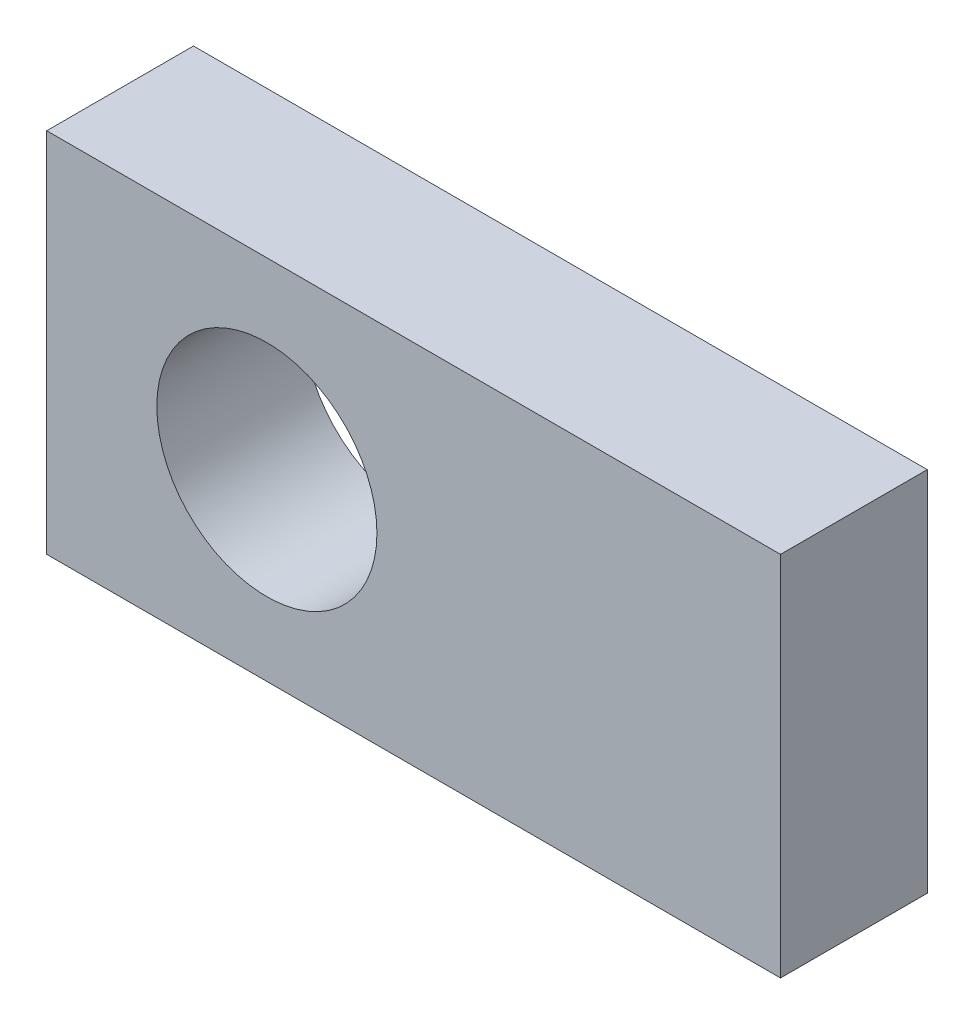
ISO-10303-21;
HEADER;
FILE_DESCRIPTION(('STEP AP214'),'2;1');
FILE_NAME('part.step','',(''),(''),'','','');
FILE_SCHEMA(('AUTOMOTIVE_DESIGN { 1 0 10303 214 1 1 1 1 }'));
ENDSEC;
DATA;
#1=APPLICATION_CONTEXT('core data for automotive mechanical design processes');
#2=APPLICATION_PROTOCOL_DEFINITION('international standard','automotive_design',2000,#1);
#3=PRODUCT_CONTEXT('',#1,'mechanical');
#4=PRODUCT('Part','Part','',(#3));
#5=PRODUCT_RELATED_PRODUCT_CATEGORY('part','',(#4));
#6=PRODUCT_DEFINITION_FORMATION('','',#4);
#7=PRODUCT_DEFINITION_CONTEXT('part definition',#1,'design');
#8=PRODUCT_DEFINITION('design','',#6,#7);
#9=PRODUCT_DEFINITION_SHAPE('','',#8);
#10=(LENGTH_UNIT() NAMED_UNIT(*) SI_UNIT(.MILLI.,.METRE.));
#11=(NAMED_UNIT(*) PLANE_ANGLE_UNIT() SI_UNIT($,.RADIAN.));
#12=(NAMED_UNIT(*) SI_UNIT($,.STERADIAN.) SOLID_ANGLE_UNIT());
#13=UNCERTAINTY_MEASURE_WITH_UNIT(LENGTH_MEASURE(1.E-05),#10,'distance_accuracy_value','');
#14=(GEOMETRIC_REPRESENTATION_CONTEXT(3) GLOBAL_UNCERTAINTY_ASSIGNED_CONTEXT((#13)) GLOBAL_UNIT_ASSIGNED_CONTEXT((#10,
#11,#12)) REPRESENTATION_CONTEXT('',''));
#15=CARTESIAN_POINT('',(0.,0.,0.));
#16=DIRECTION('',(0.,0.,1.));
#17=DIRECTION('',(1.,0.,0.));
#18=AXIS2_PLACEMENT_3D('',#15,#16,#17);
#19=CARTESIAN_POINT('',(0.,0.,4.));
#20=DIRECTION('',(0.,0.,-1.));
#21=DIRECTION('',(-1.,0.,0.));
#22=AXIS2_PLACEMENT_3D('',#19,#20,#21);
#23=PLANE('',#22);
#24=DIRECTION('',(0.,-1.,0.));
#25=VECTOR('',#24,1.);
#26=CARTESIAN_POINT('',(0.,0.,4.));
#27=LINE('',#26,#25);
#28=CARTESIAN_POINT('',(0.,10.,4.));
#29=VERTEX_POINT('',#28);
#30=CARTESIAN_POINT('',(0.,0.,4.));
#31=VERTEX_POINT('',#30);
#32=EDGE_CURVE('E84',#29,#31,#27,.T.);
#33=ORIENTED_EDGE('',*,*,#32,.T.);
#34=DIRECTION('',(1.,0.,0.));
#35=VECTOR('',#34,1.);
#36=CARTESIAN_POINT('',(0.,0.,4.));
#37=LINE('',#36,#35);
#38=CARTESIAN_POINT('',(20.,0.,4.));
#39=VERTEX_POINT('',#38);
#40=EDGE_CURVE('E79',#31,#39,#37,.T.);
#41=ORIENTED_EDGE('',*,*,#40,.T.);
#42=DIRECTION('',(0.,1.,0.));
#43=VECTOR('',#42,1.);
#44=CARTESIAN_POINT('',(20.,0.,4.));
#45=LINE('',#44,#43);
#46=CARTESIAN_POINT('',(20.,10.,4.));
#47=VERTEX_POINT('',#46);
#48=EDGE_CURVE('E82',#39,#47,#45,.T.);
#49=ORIENTED_EDGE('',*,*,#48,.T.);
#50=DIRECTION('',(-1.,0.,0.));
#51=VECTOR('',#50,1.);
#52=CARTESIAN_POINT('',(0.,10.,4.));
#53=LINE('',#52,#51);
#54=EDGE_CURVE('E49',#47,#29,#53,.T.);
#55=ORIENTED_EDGE('',*,*,#54,.T.);
#56=EDGE_LOOP('',(#33,#41,#49,#55));
#57=FACE_BOUND('',#56,.T.);
#58=CARTESIAN_POINT('',(6.,5.,4.));
#59=DIRECTION('',(0.,0.,1.));
#60=DIRECTION('',(1.,0.,0.));
#61=AXIS2_PLACEMENT_3D('',#58,#59,#60);
#62=CIRCLE('',#61,3.);
#63=CARTESIAN_POINT('',(9.,5.,4.));
#64=VERTEX_POINT('',#63);
#65=EDGE_CURVE('E99',#64,#64,#62,.T.);
#66=ORIENTED_EDGE('',*,*,#65,.F.);
#67=EDGE_LOOP('',(#66));
#68=FACE_BOUND('',#67,.T.);
#69=ADVANCED_FACE('F32',(#57,#68),#23,.F.);
#70=CARTESIAN_POINT('',(0.,0.,0.));
#71=DIRECTION('',(0.,0.,-1.));
#72=DIRECTION('',(-1.,0.,0.));
#73=AXIS2_PLACEMENT_3D('',#70,#71,#72);
#74=PLANE('',#73);
#75=DIRECTION('',(0.,-1.,0.));
#76=VECTOR('',#75,1.);
#77=CARTESIAN_POINT('',(0.,0.,0.));
#78=LINE('',#77,#76);
#79=CARTESIAN_POINT('',(0.,10.,0.));
#80=VERTEX_POINT('',#79);
#81=CARTESIAN_POINT('',(0.,0.,0.));
#82=VERTEX_POINT('',#81);
#83=EDGE_CURVE('E96',#80,#82,#78,.T.);
#84=ORIENTED_EDGE('',*,*,#83,.F.);
#85=DIRECTION('',(-1.,0.,0.));
#86=VECTOR('',#85,1.);
#87=CARTESIAN_POINT('',(0.,10.,0.));
#88=LINE('',#87,#86);
#89=CARTESIAN_POINT('',(20.,10.,0.));
#90=VERTEX_POINT('',#89);
#91=EDGE_CURVE('E72',#90,#80,#88,.T.);
#92=ORIENTED_EDGE('',*,*,#91,.F.);
#93=DIRECTION('',(0.,1.,0.));
#94=VECTOR('',#93,1.);
#95=CARTESIAN_POINT('',(20.,0.,0.));
#96=LINE('',#95,#94);
#97=CARTESIAN_POINT('',(20.,0.,0.));
#98=VERTEX_POINT('',#97);
#99=EDGE_CURVE('E66',#98,#90,#96,.T.);
#100=ORIENTED_EDGE('',*,*,#99,.F.);
#101=DIRECTION('',(1.,0.,0.));
#102=VECTOR('',#101,1.);
#103=CARTESIAN_POINT('',(0.,0.,0.));
#104=LINE('',#103,#102);
#105=EDGE_CURVE('E88',#82,#98,#104,.T.);
#106=ORIENTED_EDGE('',*,*,#105,.F.);
#107=EDGE_LOOP('',(#84,#92,#100,#106));
#108=FACE_BOUND('',#107,.T.);
#109=CARTESIAN_POINT('',(6.,5.,0.));
#110=DIRECTION('',(0.,0.,1.));
#111=DIRECTION('',(1.,0.,0.));
#112=AXIS2_PLACEMENT_3D('',#109,#110,#111);
#113=CIRCLE('',#112,3.);
#114=CARTESIAN_POINT('',(9.,5.,0.));
#115=VERTEX_POINT('',#114);
#116=EDGE_CURVE('E111',#115,#115,#113,.T.);
#117=ORIENTED_EDGE('',*,*,#116,.T.);
#118=EDGE_LOOP('',(#117));
#119=FACE_BOUND('',#118,.T.);
#120=ADVANCED_FACE('F107',(#108,#119),#74,.T.);
#121=CARTESIAN_POINT('',(0.,0.,4.));
#122=DIRECTION('',(1.,0.,0.));
#123=DIRECTION('',(0.,0.,-1.));
#124=AXIS2_PLACEMENT_3D('',#121,#122,#123);
#125=PLANE('',#124);
#126=ORIENTED_EDGE('',*,*,#83,.T.);
#127=DIRECTION('',(0.,0.,-1.));
#128=VECTOR('',#127,1.);
#129=CARTESIAN_POINT('',(0.,0.,4.));
#130=LINE('',#129,#128);
#131=EDGE_CURVE('E11',#31,#82,#130,.T.);
#132=ORIENTED_EDGE('',*,*,#131,.F.);
#133=ORIENTED_EDGE('',*,*,#32,.F.);
#134=DIRECTION('',(0.,0.,-1.));
#135=VECTOR('',#134,1.);
#136=CARTESIAN_POINT('',(0.,10.,4.));
#137=LINE('',#136,#135);
#138=EDGE_CURVE('E92',#29,#80,#137,.T.);
#139=ORIENTED_EDGE('',*,*,#138,.T.);
#140=EDGE_LOOP('',(#126,#132,#133,#139));
#141=FACE_BOUND('',#140,.T.);
#142=ADVANCED_FACE('F34',(#141),#125,.F.);
#143=CARTESIAN_POINT('',(0.,0.,4.));
#144=DIRECTION('',(0.,1.,0.));
#145=DIRECTION('',(0.,0.,1.));
#146=AXIS2_PLACEMENT_3D('',#143,#144,#145);
#147=PLANE('',#146);
#148=ORIENTED_EDGE('',*,*,#105,.T.);
#149=DIRECTION('',(0.,0.,-1.));
#150=VECTOR('',#149,1.);
#151=CARTESIAN_POINT('',(20.,0.,4.));
#152=LINE('',#151,#150);
#153=EDGE_CURVE('E41',#39,#98,#152,.T.);
#154=ORIENTED_EDGE('',*,*,#153,.F.);
#155=ORIENTED_EDGE('',*,*,#40,.F.);
#156=ORIENTED_EDGE('',*,*,#131,.T.);
#157=EDGE_LOOP('',(#148,#154,#155,#156));
#158=FACE_BOUND('',#157,.T.);
#159=ADVANCED_FACE('F87',(#158),#147,.F.);
#160=CARTESIAN_POINT('',(20.,0.,4.));
#161=DIRECTION('',(-1.,0.,0.));
#162=DIRECTION('',(0.,0.,1.));
#163=AXIS2_PLACEMENT_3D('',#160,#161,#162);
#164=PLANE('',#163);
#165=ORIENTED_EDGE('',*,*,#99,.T.);
#166=DIRECTION('',(0.,0.,-1.));
#167=VECTOR('',#166,1.);
#168=CARTESIAN_POINT('',(20.,10.,4.));
#169=LINE('',#168,#167);
#170=EDGE_CURVE('E89',#47,#90,#169,.T.);
#171=ORIENTED_EDGE('',*,*,#170,.F.);
#172=ORIENTED_EDGE('',*,*,#48,.F.);
#173=ORIENTED_EDGE('',*,*,#153,.T.);
#174=EDGE_LOOP('',(#165,#171,#172,#173));
#175=FACE_BOUND('',#174,.T.);
#176=ADVANCED_FACE('F90',(#175),#164,.F.);
#177=CARTESIAN_POINT('',(0.,10.,4.));
#178=DIRECTION('',(0.,-1.,0.));
#179=DIRECTION('',(0.,0.,-1.));
#180=AXIS2_PLACEMENT_3D('',#177,#178,#179);
#181=PLANE('',#180);
#182=ORIENTED_EDGE('',*,*,#91,.T.);
#183=ORIENTED_EDGE('',*,*,#138,.F.);
#184=ORIENTED_EDGE('',*,*,#54,.F.);
#185=ORIENTED_EDGE('',*,*,#170,.T.);
#186=EDGE_LOOP('',(#182,#183,#184,#185));
#187=FACE_BOUND('',#186,.T.);
#188=ADVANCED_FACE('F104',(#187),#181,.F.);
#189=CARTESIAN_POINT('',(6.,5.,4.));
#190=DIRECTION('',(0.,0.,-1.));
#191=DIRECTION('',(-1.,0.,0.));
#192=AXIS2_PLACEMENT_3D('',#189,#190,#191);
#193=CYLINDRICAL_SURFACE('',#192,3.);
#194=ORIENTED_EDGE('',*,*,#65,.T.);
#195=EDGE_LOOP('',(#194));
#196=FACE_BOUND('',#195,.T.);
#197=ORIENTED_EDGE('',*,*,#116,.F.);
#198=EDGE_LOOP('',(#197));
#199=FACE_BOUND('',#198,.T.);
#200=ADVANCED_FACE('F117',(#196,#199),#193,.F.);
#201=CLOSED_SHELL('',(#69,#120,#142,#159,#176,#188,#200));
#202=MANIFOLD_SOLID_BREP('B2',#201);
#203=ADVANCED_BREP_SHAPE_REPRESENTATION('',(#18,#202),#14);
#204=SHAPE_DEFINITION_REPRESENTATION(#9,#203);
ENDSEC;
END-ISO-10303-21;
